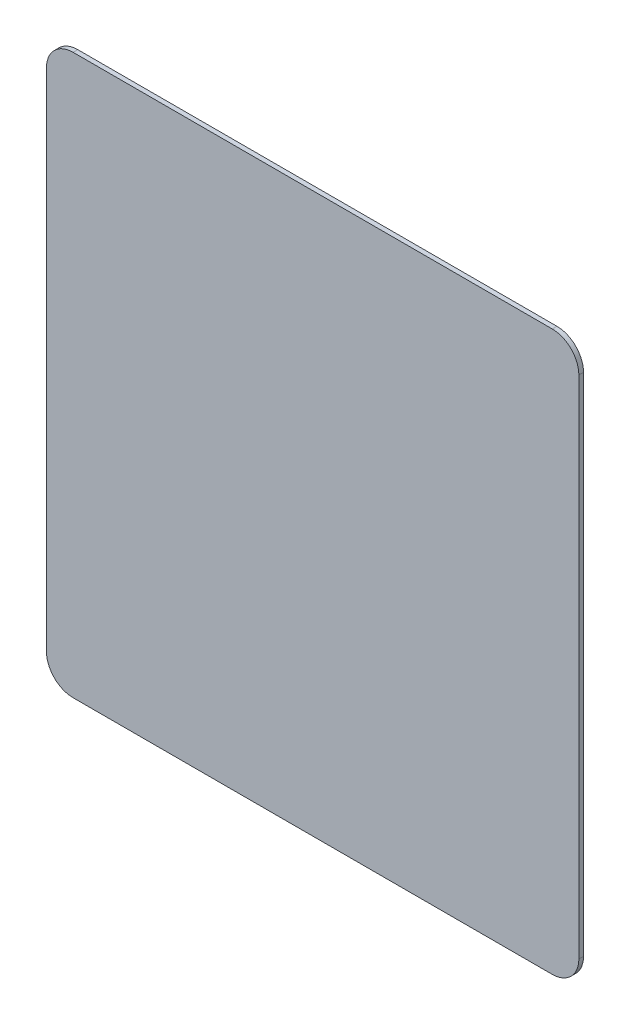
ISO-10303-21;
HEADER;
FILE_DESCRIPTION(('STEP AP214'),'2;1');
FILE_NAME('part.step','',(''),(''),'','','');
FILE_SCHEMA(('AUTOMOTIVE_DESIGN { 1 0 10303 214 1 1 1 1 }'));
ENDSEC;
DATA;
#1=APPLICATION_CONTEXT('core data for automotive mechanical design processes');
#2=APPLICATION_PROTOCOL_DEFINITION('international standard','automotive_design',2000,#1);
#3=PRODUCT_CONTEXT('',#1,'mechanical');
#4=PRODUCT('Part','Part','',(#3));
#5=PRODUCT_RELATED_PRODUCT_CATEGORY('part','',(#4));
#6=PRODUCT_DEFINITION_FORMATION('','',#4);
#7=PRODUCT_DEFINITION_CONTEXT('part definition',#1,'design');
#8=PRODUCT_DEFINITION('design','',#6,#7);
#9=PRODUCT_DEFINITION_SHAPE('','',#8);
#10=(LENGTH_UNIT() NAMED_UNIT(*) SI_UNIT(.MILLI.,.METRE.));
#11=(NAMED_UNIT(*) PLANE_ANGLE_UNIT() SI_UNIT($,.RADIAN.));
#12=(NAMED_UNIT(*) SI_UNIT($,.STERADIAN.) SOLID_ANGLE_UNIT());
#13=UNCERTAINTY_MEASURE_WITH_UNIT(LENGTH_MEASURE(1.E-05),#10,'distance_accuracy_value','');
#14=(GEOMETRIC_REPRESENTATION_CONTEXT(3) GLOBAL_UNCERTAINTY_ASSIGNED_CONTEXT((#13)) GLOBAL_UNIT_ASSIGNED_CONTEXT((#10,
#11,#12)) REPRESENTATION_CONTEXT('',''));
#15=CARTESIAN_POINT('',(0.,0.,0.));
#16=DIRECTION('',(0.,0.,1.));
#17=DIRECTION('',(1.,0.,0.));
#18=AXIS2_PLACEMENT_3D('',#15,#16,#17);
#19=CARTESIAN_POINT('',(-5.,16.6500000000116,3.7));
#20=DIRECTION('',(-1.,0.,0.));
#21=DIRECTION('',(0.,-1.,0.));
#22=AXIS2_PLACEMENT_3D('',#19,#20,#21);
#23=PLANE('',#22);
#24=DIRECTION('',(0.,-1.,0.));
#25=VECTOR('',#24,1.);
#26=CARTESIAN_POINT('',(-5.,14.7500000000058,3.735));
#27=LINE('',#26,#25);
#28=CARTESIAN_POINT('',(-5.,16.6500000000116,3.735));
#29=VERTEX_POINT('',#28);
#30=CARTESIAN_POINT('',(-5.,12.85,3.735));
#31=VERTEX_POINT('',#30);
#32=EDGE_CURVE('E78',#29,#31,#27,.T.);
#33=ORIENTED_EDGE('',*,*,#32,.F.);
#34=DIRECTION('',(0.,0.,-1.));
#35=VECTOR('',#34,1.);
#36=CARTESIAN_POINT('',(-5.,16.6500000000116,3.7175));
#37=LINE('',#36,#35);
#38=CARTESIAN_POINT('',(-5.,16.6500000000116,3.7));
#39=VERTEX_POINT('',#38);
#40=EDGE_CURVE('E72',#29,#39,#37,.T.);
#41=ORIENTED_EDGE('',*,*,#40,.T.);
#42=DIRECTION('',(0.,1.,0.));
#43=VECTOR('',#42,1.);
#44=CARTESIAN_POINT('',(-5.,14.7500000000058,3.7));
#45=LINE('',#44,#43);
#46=CARTESIAN_POINT('',(-5.,12.85,3.7));
#47=VERTEX_POINT('',#46);
#48=EDGE_CURVE('E75',#47,#39,#45,.T.);
#49=ORIENTED_EDGE('',*,*,#48,.F.);
#50=DIRECTION('',(0.,0.,-1.));
#51=VECTOR('',#50,1.);
#52=CARTESIAN_POINT('',(-5.,12.85,3.7175));
#53=LINE('',#52,#51);
#54=EDGE_CURVE('E79',#31,#47,#53,.T.);
#55=ORIENTED_EDGE('',*,*,#54,.F.);
#56=EDGE_LOOP('',(#33,#41,#49,#55));
#57=FACE_BOUND('',#56,.T.);
#58=ADVANCED_FACE('F17',(#57),#23,.T.);
#59=CARTESIAN_POINT('',(-4.8,12.85,3.735));
#60=DIRECTION('',(0.,0.,-1.));
#61=DIRECTION('',(-1.,0.,0.));
#62=AXIS2_PLACEMENT_3D('',#59,#60,#61);
#63=CYLINDRICAL_SURFACE('',#62,0.200000000000002);
#64=CARTESIAN_POINT('',(-4.8,12.85,3.735));
#65=DIRECTION('',(0.,0.,-1.));
#66=DIRECTION('',(-1.,0.,0.));
#67=AXIS2_PLACEMENT_3D('',#64,#65,#66);
#68=CIRCLE('',#67,0.200000000000002);
#69=CARTESIAN_POINT('',(-4.8,12.65,3.735));
#70=VERTEX_POINT('',#69);
#71=EDGE_CURVE('E120',#31,#70,#68,.F.);
#72=ORIENTED_EDGE('',*,*,#71,.F.);
#73=ORIENTED_EDGE('',*,*,#54,.T.);
#74=CARTESIAN_POINT('',(-4.8,12.85,3.7));
#75=DIRECTION('',(0.,0.,-1.));
#76=DIRECTION('',(-1.,0.,0.));
#77=AXIS2_PLACEMENT_3D('',#74,#75,#76);
#78=CIRCLE('',#77,0.200000000000002);
#79=CARTESIAN_POINT('',(-4.8,12.65,3.7));
#80=VERTEX_POINT('',#79);
#81=EDGE_CURVE('E90',#80,#47,#78,.T.);
#82=ORIENTED_EDGE('',*,*,#81,.F.);
#83=DIRECTION('',(0.,0.,-1.));
#84=VECTOR('',#83,1.);
#85=CARTESIAN_POINT('',(-4.8,12.65,3.7175));
#86=LINE('',#85,#84);
#87=EDGE_CURVE('E106',#70,#80,#86,.T.);
#88=ORIENTED_EDGE('',*,*,#87,.F.);
#89=EDGE_LOOP('',(#72,#73,#82,#88));
#90=FACE_BOUND('',#89,.T.);
#91=ADVANCED_FACE('F163',(#90),#63,.T.);
#92=CARTESIAN_POINT('',(-4.8,12.65,3.7));
#93=DIRECTION('',(0.,-1.,0.));
#94=DIRECTION('',(1.,0.,0.));
#95=AXIS2_PLACEMENT_3D('',#92,#93,#94);
#96=PLANE('',#95);
#97=DIRECTION('',(1.,0.,0.));
#98=VECTOR('',#97,1.);
#99=CARTESIAN_POINT('',(-3.,12.65,3.735));
#100=LINE('',#99,#98);
#101=CARTESIAN_POINT('',(-1.2,12.65,3.735));
#102=VERTEX_POINT('',#101);
#103=EDGE_CURVE('E119',#70,#102,#100,.T.);
#104=ORIENTED_EDGE('',*,*,#103,.F.);
#105=ORIENTED_EDGE('',*,*,#87,.T.);
#106=DIRECTION('',(-1.,0.,0.));
#107=VECTOR('',#106,1.);
#108=CARTESIAN_POINT('',(-3.,12.65,3.7));
#109=LINE('',#108,#107);
#110=CARTESIAN_POINT('',(-1.2,12.65,3.7));
#111=VERTEX_POINT('',#110);
#112=EDGE_CURVE('E123',#111,#80,#109,.T.);
#113=ORIENTED_EDGE('',*,*,#112,.F.);
#114=DIRECTION('',(0.,0.,-1.));
#115=VECTOR('',#114,1.);
#116=CARTESIAN_POINT('',(-1.2,12.65,3.7175));
#117=LINE('',#116,#115);
#118=EDGE_CURVE('E104',#102,#111,#117,.T.);
#119=ORIENTED_EDGE('',*,*,#118,.F.);
#120=EDGE_LOOP('',(#104,#105,#113,#119));
#121=FACE_BOUND('',#120,.T.);
#122=ADVANCED_FACE('F160',(#121),#96,.T.);
#123=CARTESIAN_POINT('',(-1.2,12.85,3.735));
#124=DIRECTION('',(0.,0.,-1.));
#125=DIRECTION('',(-1.,0.,0.));
#126=AXIS2_PLACEMENT_3D('',#123,#124,#125);
#127=CYLINDRICAL_SURFACE('',#126,0.200000000000001);
#128=CARTESIAN_POINT('',(-1.2,12.85,3.735));
#129=DIRECTION('',(0.,0.,-1.));
#130=DIRECTION('',(-1.,0.,0.));
#131=AXIS2_PLACEMENT_3D('',#128,#129,#130);
#132=CIRCLE('',#131,0.200000000000001);
#133=CARTESIAN_POINT('',(-1.,12.85,3.735));
#134=VERTEX_POINT('',#133);
#135=EDGE_CURVE('E116',#102,#134,#132,.F.);
#136=ORIENTED_EDGE('',*,*,#135,.F.);
#137=ORIENTED_EDGE('',*,*,#118,.T.);
#138=CARTESIAN_POINT('',(-1.2,12.85,3.7));
#139=DIRECTION('',(0.,0.,-1.));
#140=DIRECTION('',(-1.,0.,0.));
#141=AXIS2_PLACEMENT_3D('',#138,#139,#140);
#142=CIRCLE('',#141,0.200000000000001);
#143=CARTESIAN_POINT('',(-1.,12.85,3.7));
#144=VERTEX_POINT('',#143);
#145=EDGE_CURVE('E124',#144,#111,#142,.T.);
#146=ORIENTED_EDGE('',*,*,#145,.F.);
#147=DIRECTION('',(0.,0.,-1.));
#148=VECTOR('',#147,1.);
#149=CARTESIAN_POINT('',(-1.,12.85,3.7175));
#150=LINE('',#149,#148);
#151=EDGE_CURVE('E91',#134,#144,#150,.T.);
#152=ORIENTED_EDGE('',*,*,#151,.F.);
#153=EDGE_LOOP('',(#136,#137,#146,#152));
#154=FACE_BOUND('',#153,.T.);
#155=ADVANCED_FACE('F157',(#154),#127,.T.);
#156=CARTESIAN_POINT('',(-1.,12.85,3.7));
#157=DIRECTION('',(1.,0.,0.));
#158=DIRECTION('',(0.,1.,0.));
#159=AXIS2_PLACEMENT_3D('',#156,#157,#158);
#160=PLANE('',#159);
#161=DIRECTION('',(0.,1.,0.));
#162=VECTOR('',#161,1.);
#163=CARTESIAN_POINT('',(-1.,14.7500000000058,3.735));
#164=LINE('',#163,#162);
#165=CARTESIAN_POINT('',(-1.,16.6500000000116,3.735));
#166=VERTEX_POINT('',#165);
#167=EDGE_CURVE('E115',#134,#166,#164,.T.);
#168=ORIENTED_EDGE('',*,*,#167,.F.);
#169=ORIENTED_EDGE('',*,*,#151,.T.);
#170=DIRECTION('',(0.,-1.,0.));
#171=VECTOR('',#170,1.);
#172=CARTESIAN_POINT('',(-1.,14.7500000000058,3.7));
#173=LINE('',#172,#171);
#174=CARTESIAN_POINT('',(-1.,16.6500000000116,3.7));
#175=VERTEX_POINT('',#174);
#176=EDGE_CURVE('E85',#175,#144,#173,.T.);
#177=ORIENTED_EDGE('',*,*,#176,.F.);
#178=DIRECTION('',(0.,0.,1.));
#179=VECTOR('',#178,1.);
#180=CARTESIAN_POINT('',(-1.,16.6500000000116,3.7175));
#181=LINE('',#180,#179);
#182=EDGE_CURVE('E93',#175,#166,#181,.T.);
#183=ORIENTED_EDGE('',*,*,#182,.T.);
#184=EDGE_LOOP('',(#168,#169,#177,#183));
#185=FACE_BOUND('',#184,.T.);
#186=ADVANCED_FACE('F132',(#185),#160,.T.);
#187=CARTESIAN_POINT('',(-1.,12.65,3.7));
#188=DIRECTION('',(0.,0.,-1.));
#189=DIRECTION('',(-1.,0.,0.));
#190=AXIS2_PLACEMENT_3D('',#187,#188,#189);
#191=PLANE('',#190);
#192=ORIENTED_EDGE('',*,*,#112,.T.);
#193=ORIENTED_EDGE('',*,*,#81,.T.);
#194=ORIENTED_EDGE('',*,*,#48,.T.);
#195=CARTESIAN_POINT('',(-4.8,16.6500000000116,3.7));
#196=DIRECTION('',(0.,0.,-1.));
#197=DIRECTION('',(-1.,0.,0.));
#198=AXIS2_PLACEMENT_3D('',#195,#196,#197);
#199=CIRCLE('',#198,0.2);
#200=CARTESIAN_POINT('',(-4.8,16.8500000000116,3.7));
#201=VERTEX_POINT('',#200);
#202=EDGE_CURVE('E21',#39,#201,#199,.T.);
#203=ORIENTED_EDGE('',*,*,#202,.T.);
#204=DIRECTION('',(-1.,0.,0.));
#205=VECTOR('',#204,1.);
#206=CARTESIAN_POINT('',(-3.,16.8500000000116,3.7));
#207=LINE('',#206,#205);
#208=CARTESIAN_POINT('',(-1.2,16.8500000000116,3.7));
#209=VERTEX_POINT('',#208);
#210=EDGE_CURVE('E98',#209,#201,#207,.T.);
#211=ORIENTED_EDGE('',*,*,#210,.F.);
#212=CARTESIAN_POINT('',(-1.2,16.6500000000116,3.7));
#213=DIRECTION('',(0.,0.,-1.));
#214=DIRECTION('',(0.,1.,0.));
#215=AXIS2_PLACEMENT_3D('',#212,#213,#214);
#216=CIRCLE('',#215,0.199999999999999);
#217=EDGE_CURVE('E111',#175,#209,#216,.F.);
#218=ORIENTED_EDGE('',*,*,#217,.F.);
#219=ORIENTED_EDGE('',*,*,#176,.T.);
#220=ORIENTED_EDGE('',*,*,#145,.T.);
#221=EDGE_LOOP('',(#192,#193,#194,#203,#211,#218,#219,#220));
#222=FACE_BOUND('',#221,.T.);
#223=ADVANCED_FACE('F88',(#222),#191,.T.);
#224=CARTESIAN_POINT('',(-5.,12.65,3.735));
#225=DIRECTION('',(0.,0.,1.));
#226=DIRECTION('',(1.,0.,0.));
#227=AXIS2_PLACEMENT_3D('',#224,#225,#226);
#228=PLANE('',#227);
#229=DIRECTION('',(1.,0.,0.));
#230=VECTOR('',#229,1.);
#231=CARTESIAN_POINT('',(-3.,16.8500000000116,3.735));
#232=LINE('',#231,#230);
#233=CARTESIAN_POINT('',(-4.8,16.8500000000116,3.735));
#234=VERTEX_POINT('',#233);
#235=CARTESIAN_POINT('',(-1.2,16.8500000000116,3.735));
#236=VERTEX_POINT('',#235);
#237=EDGE_CURVE('E99',#234,#236,#232,.T.);
#238=ORIENTED_EDGE('',*,*,#237,.F.);
#239=CARTESIAN_POINT('',(-4.8,16.6500000000116,3.735));
#240=DIRECTION('',(0.,0.,-1.));
#241=DIRECTION('',(-1.,0.,0.));
#242=AXIS2_PLACEMENT_3D('',#239,#240,#241);
#243=CIRCLE('',#242,0.2);
#244=EDGE_CURVE('E34',#234,#29,#243,.F.);
#245=ORIENTED_EDGE('',*,*,#244,.T.);
#246=ORIENTED_EDGE('',*,*,#32,.T.);
#247=ORIENTED_EDGE('',*,*,#71,.T.);
#248=ORIENTED_EDGE('',*,*,#103,.T.);
#249=ORIENTED_EDGE('',*,*,#135,.T.);
#250=ORIENTED_EDGE('',*,*,#167,.T.);
#251=CARTESIAN_POINT('',(-1.2,16.6500000000116,3.735));
#252=DIRECTION('',(0.,0.,-1.));
#253=DIRECTION('',(0.,1.,0.));
#254=AXIS2_PLACEMENT_3D('',#251,#252,#253);
#255=CIRCLE('',#254,0.199999999999999);
#256=EDGE_CURVE('E100',#236,#166,#255,.T.);
#257=ORIENTED_EDGE('',*,*,#256,.F.);
#258=EDGE_LOOP('',(#238,#245,#246,#247,#248,#249,#250,#257));
#259=FACE_BOUND('',#258,.T.);
#260=ADVANCED_FACE('F153',(#259),#228,.T.);
#261=CARTESIAN_POINT('',(-1.2,16.6500000000116,3.735));
#262=DIRECTION('',(0.,0.,-1.));
#263=DIRECTION('',(0.,1.,0.));
#264=AXIS2_PLACEMENT_3D('',#261,#262,#263);
#265=CYLINDRICAL_SURFACE('',#264,0.199999999999999);
#266=ORIENTED_EDGE('',*,*,#256,.T.);
#267=ORIENTED_EDGE('',*,*,#182,.F.);
#268=ORIENTED_EDGE('',*,*,#217,.T.);
#269=DIRECTION('',(0.,0.,-1.));
#270=VECTOR('',#269,1.);
#271=CARTESIAN_POINT('',(-1.2,16.8500000000116,3.7175));
#272=LINE('',#271,#270);
#273=EDGE_CURVE('E27',#236,#209,#272,.T.);
#274=ORIENTED_EDGE('',*,*,#273,.F.);
#275=EDGE_LOOP('',(#266,#267,#268,#274));
#276=FACE_BOUND('',#275,.T.);
#277=ADVANCED_FACE('F144',(#276),#265,.T.);
#278=CARTESIAN_POINT('',(-1.2,16.8500000000116,3.7));
#279=DIRECTION('',(0.,1.,0.));
#280=DIRECTION('',(-1.,0.,0.));
#281=AXIS2_PLACEMENT_3D('',#278,#279,#280);
#282=PLANE('',#281);
#283=ORIENTED_EDGE('',*,*,#237,.T.);
#284=ORIENTED_EDGE('',*,*,#273,.T.);
#285=ORIENTED_EDGE('',*,*,#210,.T.);
#286=DIRECTION('',(0.,0.,-1.));
#287=VECTOR('',#286,1.);
#288=CARTESIAN_POINT('',(-4.8,16.8500000000116,3.7175));
#289=LINE('',#288,#287);
#290=EDGE_CURVE('E11',#234,#201,#289,.T.);
#291=ORIENTED_EDGE('',*,*,#290,.F.);
#292=EDGE_LOOP('',(#283,#284,#285,#291));
#293=FACE_BOUND('',#292,.T.);
#294=ADVANCED_FACE('F146',(#293),#282,.T.);
#295=CARTESIAN_POINT('',(-4.8,16.6500000000116,3.735));
#296=DIRECTION('',(0.,0.,-1.));
#297=DIRECTION('',(-1.,0.,0.));
#298=AXIS2_PLACEMENT_3D('',#295,#296,#297);
#299=CYLINDRICAL_SURFACE('',#298,0.2);
#300=ORIENTED_EDGE('',*,*,#244,.F.);
#301=ORIENTED_EDGE('',*,*,#290,.T.);
#302=ORIENTED_EDGE('',*,*,#202,.F.);
#303=ORIENTED_EDGE('',*,*,#40,.F.);
#304=EDGE_LOOP('',(#300,#301,#302,#303));
#305=FACE_BOUND('',#304,.T.);
#306=ADVANCED_FACE('F19',(#305),#299,.T.);
#307=CLOSED_SHELL('',(#58,#91,#122,#155,#186,#223,#260,#277,#294,#306));
#308=MANIFOLD_SOLID_BREP('B1',#307);
#309=ADVANCED_BREP_SHAPE_REPRESENTATION('',(#18,#308),#14);
#310=SHAPE_DEFINITION_REPRESENTATION(#9,#309);
ENDSEC;
END-ISO-10303-21;
